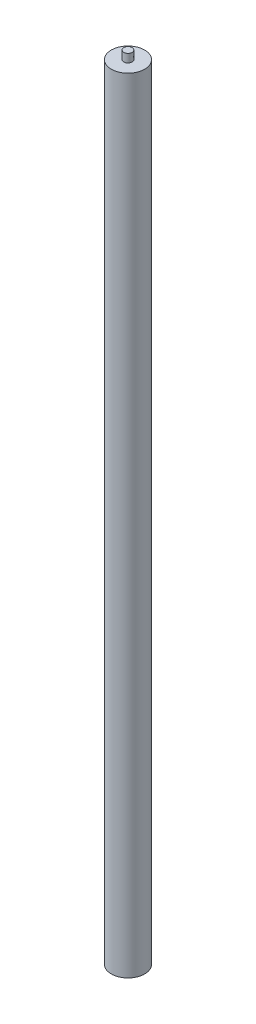
ISO-10303-21;
HEADER;
FILE_DESCRIPTION(('STEP AP214'),'2;1');
FILE_NAME('part.step','',(''),(''),'','','');
FILE_SCHEMA(('AUTOMOTIVE_DESIGN { 1 0 10303 214 1 1 1 1 }'));
ENDSEC;
DATA;
#1=APPLICATION_CONTEXT('core data for automotive mechanical design processes');
#2=APPLICATION_PROTOCOL_DEFINITION('international standard','automotive_design',2000,#1);
#3=PRODUCT_CONTEXT('',#1,'mechanical');
#4=PRODUCT('Part','Part','',(#3));
#5=PRODUCT_RELATED_PRODUCT_CATEGORY('part','',(#4));
#6=PRODUCT_DEFINITION_FORMATION('','',#4);
#7=PRODUCT_DEFINITION_CONTEXT('part definition',#1,'design');
#8=PRODUCT_DEFINITION('design','',#6,#7);
#9=PRODUCT_DEFINITION_SHAPE('','',#8);
#10=(LENGTH_UNIT() NAMED_UNIT(*) SI_UNIT(.MILLI.,.METRE.));
#11=(NAMED_UNIT(*) PLANE_ANGLE_UNIT() SI_UNIT($,.RADIAN.));
#12=(NAMED_UNIT(*) SI_UNIT($,.STERADIAN.) SOLID_ANGLE_UNIT());
#13=UNCERTAINTY_MEASURE_WITH_UNIT(LENGTH_MEASURE(1.E-05),#10,'distance_accuracy_value','');
#14=(GEOMETRIC_REPRESENTATION_CONTEXT(3) GLOBAL_UNCERTAINTY_ASSIGNED_CONTEXT((#13)) GLOBAL_UNIT_ASSIGNED_CONTEXT((#10,
#11,#12)) REPRESENTATION_CONTEXT('',''));
#15=CARTESIAN_POINT('',(0.,0.,0.));
#16=DIRECTION('',(0.,0.,1.));
#17=DIRECTION('',(1.,0.,0.));
#18=AXIS2_PLACEMENT_3D('',#15,#16,#17);
#19=CARTESIAN_POINT('',(0.,596.9,0.));
#20=DIRECTION('',(0.,-1.,0.));
#21=DIRECTION('',(0.,0.,-1.));
#22=AXIS2_PLACEMENT_3D('',#19,#20,#21);
#23=CYLINDRICAL_SURFACE('',#22,12.7);
#24=CARTESIAN_POINT('',(0.,596.9,0.));
#25=DIRECTION('',(0.,1.,0.));
#26=DIRECTION('',(0.,0.,1.));
#27=AXIS2_PLACEMENT_3D('',#24,#25,#26);
#28=CIRCLE('',#27,12.7);
#29=CARTESIAN_POINT('',(0.,596.9,12.7));
#30=VERTEX_POINT('',#29);
#31=EDGE_CURVE('E38',#30,#30,#28,.T.);
#32=ORIENTED_EDGE('',*,*,#31,.F.);
#33=EDGE_LOOP('',(#32));
#34=FACE_BOUND('',#33,.T.);
#35=CARTESIAN_POINT('',(0.,0.,0.));
#36=DIRECTION('',(0.,1.,0.));
#37=DIRECTION('',(0.,0.,1.));
#38=AXIS2_PLACEMENT_3D('',#35,#36,#37);
#39=CIRCLE('',#38,12.7);
#40=CARTESIAN_POINT('',(0.,0.,12.7));
#41=VERTEX_POINT('',#40);
#42=EDGE_CURVE('E43',#41,#41,#39,.T.);
#43=ORIENTED_EDGE('',*,*,#42,.T.);
#44=EDGE_LOOP('',(#43));
#45=FACE_BOUND('',#44,.T.);
#46=ADVANCED_FACE('F31',(#34,#45),#23,.T.);
#47=CARTESIAN_POINT('',(0.,596.9,0.));
#48=DIRECTION('',(0.,1.,0.));
#49=DIRECTION('',(0.,0.,1.));
#50=AXIS2_PLACEMENT_3D('',#47,#48,#49);
#51=PLANE('',#50);
#52=CARTESIAN_POINT('',(0.,596.9,0.));
#53=DIRECTION('',(0.,1.,0.));
#54=DIRECTION('',(0.,0.,1.));
#55=AXIS2_PLACEMENT_3D('',#52,#53,#54);
#56=CIRCLE('',#55,3.175);
#57=CARTESIAN_POINT('',(0.,596.9,3.175));
#58=VERTEX_POINT('',#57);
#59=EDGE_CURVE('E10',#58,#58,#56,.T.);
#60=ORIENTED_EDGE('',*,*,#59,.F.);
#61=EDGE_LOOP('',(#60));
#62=FACE_BOUND('',#61,.T.);
#63=ORIENTED_EDGE('',*,*,#31,.T.);
#64=EDGE_LOOP('',(#63));
#65=FACE_BOUND('',#64,.T.);
#66=ADVANCED_FACE('F76',(#62,#65),#51,.T.);
#67=CARTESIAN_POINT('',(0.,0.,0.));
#68=DIRECTION('',(0.,1.,0.));
#69=DIRECTION('',(0.,0.,1.));
#70=AXIS2_PLACEMENT_3D('',#67,#68,#69);
#71=PLANE('',#70);
#72=CARTESIAN_POINT('',(0.,0.,0.));
#73=DIRECTION('',(0.,1.,0.));
#74=DIRECTION('',(0.,0.,1.));
#75=AXIS2_PLACEMENT_3D('',#72,#73,#74);
#76=CIRCLE('',#75,3.175);
#77=CARTESIAN_POINT('',(0.,0.,3.175));
#78=VERTEX_POINT('',#77);
#79=EDGE_CURVE('E34',#78,#78,#76,.T.);
#80=ORIENTED_EDGE('',*,*,#79,.T.);
#81=EDGE_LOOP('',(#80));
#82=FACE_BOUND('',#81,.T.);
#83=ORIENTED_EDGE('',*,*,#42,.F.);
#84=EDGE_LOOP('',(#83));
#85=FACE_BOUND('',#84,.T.);
#86=ADVANCED_FACE('F81',(#82,#85),#71,.F.);
#87=CARTESIAN_POINT('',(0.,-6.34999999999997,0.));
#88=DIRECTION('',(0.,1.,0.));
#89=DIRECTION('',(0.,0.,1.));
#90=AXIS2_PLACEMENT_3D('',#87,#88,#89);
#91=PLANE('',#90);
#92=CARTESIAN_POINT('',(0.,-6.34999999999997,0.));
#93=DIRECTION('',(0.,1.,0.));
#94=DIRECTION('',(0.,0.,1.));
#95=AXIS2_PLACEMENT_3D('',#92,#93,#94);
#96=CIRCLE('',#95,3.175);
#97=CARTESIAN_POINT('',(0.,-6.34999999999997,3.175));
#98=VERTEX_POINT('',#97);
#99=EDGE_CURVE('E46',#98,#98,#96,.T.);
#100=ORIENTED_EDGE('',*,*,#99,.F.);
#101=EDGE_LOOP('',(#100));
#102=FACE_BOUND('',#101,.T.);
#103=ADVANCED_FACE('F72',(#102),#91,.F.);
#104=CARTESIAN_POINT('',(0.,-6.34999999999997,0.));
#105=DIRECTION('',(0.,1.,0.));
#106=DIRECTION('',(0.,0.,1.));
#107=AXIS2_PLACEMENT_3D('',#104,#105,#106);
#108=CYLINDRICAL_SURFACE('',#107,3.175);
#109=ORIENTED_EDGE('',*,*,#99,.T.);
#110=EDGE_LOOP('',(#109));
#111=FACE_BOUND('',#110,.T.);
#112=ORIENTED_EDGE('',*,*,#79,.F.);
#113=EDGE_LOOP('',(#112));
#114=FACE_BOUND('',#113,.T.);
#115=ADVANCED_FACE('F65',(#111,#114),#108,.T.);
#116=ORIENTED_EDGE('',*,*,#59,.T.);
#117=EDGE_LOOP('',(#116));
#118=FACE_BOUND('',#117,.T.);
#119=CARTESIAN_POINT('',(0.,603.25,0.));
#120=DIRECTION('',(0.,1.,0.));
#121=DIRECTION('',(0.,0.,1.));
#122=AXIS2_PLACEMENT_3D('',#119,#120,#121);
#123=CIRCLE('',#122,3.175);
#124=CARTESIAN_POINT('',(0.,603.25,3.175));
#125=VERTEX_POINT('',#124);
#126=EDGE_CURVE('E55',#125,#125,#123,.T.);
#127=ORIENTED_EDGE('',*,*,#126,.F.);
#128=EDGE_LOOP('',(#127));
#129=FACE_BOUND('',#128,.T.);
#130=ADVANCED_FACE('F63',(#118,#129),#108,.T.);
#131=CARTESIAN_POINT('',(0.,603.25,0.));
#132=DIRECTION('',(0.,1.,0.));
#133=DIRECTION('',(0.,0.,1.));
#134=AXIS2_PLACEMENT_3D('',#131,#132,#133);
#135=PLANE('',#134);
#136=ORIENTED_EDGE('',*,*,#126,.T.);
#137=EDGE_LOOP('',(#136));
#138=FACE_BOUND('',#137,.T.);
#139=ADVANCED_FACE('F61',(#138),#135,.T.);
#140=CLOSED_SHELL('',(#46,#66,#86,#103,#115,#130,#139));
#141=MANIFOLD_SOLID_BREP('B2',#140);
#142=ADVANCED_BREP_SHAPE_REPRESENTATION('',(#18,#141),#14);
#143=SHAPE_DEFINITION_REPRESENTATION(#9,#142);
ENDSEC;
END-ISO-10303-21;
